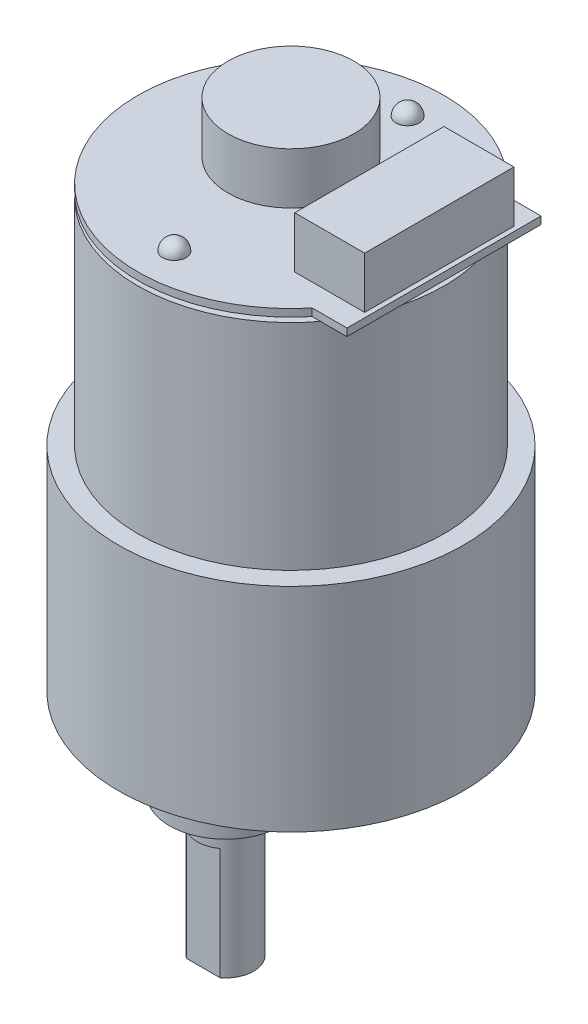
ISO-10303-21;
HEADER;
FILE_DESCRIPTION(('STEP AP214'),'2;1');
FILE_NAME('part.step','',(''),(''),'','','');
FILE_SCHEMA(('AUTOMOTIVE_DESIGN { 1 0 10303 214 1 1 1 1 }'));
ENDSEC;
DATA;
#1=APPLICATION_CONTEXT('core data for automotive mechanical design processes');
#2=APPLICATION_PROTOCOL_DEFINITION('international standard','automotive_design',2000,#1);
#3=PRODUCT_CONTEXT('',#1,'mechanical');
#4=PRODUCT('Part','Part','',(#3));
#5=PRODUCT_RELATED_PRODUCT_CATEGORY('part','',(#4));
#6=PRODUCT_DEFINITION_FORMATION('','',#4);
#7=PRODUCT_DEFINITION_CONTEXT('part definition',#1,'design');
#8=PRODUCT_DEFINITION('design','',#6,#7);
#9=PRODUCT_DEFINITION_SHAPE('','',#8);
#10=(LENGTH_UNIT() NAMED_UNIT(*) SI_UNIT(.MILLI.,.METRE.));
#11=(NAMED_UNIT(*) PLANE_ANGLE_UNIT() SI_UNIT($,.RADIAN.));
#12=(NAMED_UNIT(*) SI_UNIT($,.STERADIAN.) SOLID_ANGLE_UNIT());
#13=UNCERTAINTY_MEASURE_WITH_UNIT(LENGTH_MEASURE(1.E-05),#10,'distance_accuracy_value','');
#14=(GEOMETRIC_REPRESENTATION_CONTEXT(3) GLOBAL_UNCERTAINTY_ASSIGNED_CONTEXT((#13)) GLOBAL_UNIT_ASSIGNED_CONTEXT((#10,
#11,#12)) REPRESENTATION_CONTEXT('',''));
#15=CARTESIAN_POINT('',(0.,0.,0.));
#16=DIRECTION('',(0.,0.,1.));
#17=DIRECTION('',(1.,0.,0.));
#18=AXIS2_PLACEMENT_3D('',#15,#16,#17);
#19=CARTESIAN_POINT('',(0.,24.3,0.));
#20=DIRECTION('',(0.,-1.,0.));
#21=DIRECTION('',(0.,0.,-1.));
#22=AXIS2_PLACEMENT_3D('',#19,#20,#21);
#23=PLANE('',#22);
#24=CARTESIAN_POINT('',(0.,24.3,0.));
#25=DIRECTION('',(0.,1.,0.));
#26=DIRECTION('',(0.,0.,-1.));
#27=AXIS2_PLACEMENT_3D('',#24,#25,#26);
#28=CIRCLE('',#27,16.4);
#29=CARTESIAN_POINT('',(12.6806939873179,24.3,-10.4));
#30=VERTEX_POINT('',#29);
#31=CARTESIAN_POINT('',(12.6806939873179,24.3,10.4));
#32=VERTEX_POINT('',#31);
#33=EDGE_CURVE('E178',#30,#32,#28,.T.);
#34=ORIENTED_EDGE('',*,*,#33,.T.);
#35=DIRECTION('',(1.,0.,0.));
#36=VECTOR('',#35,1.);
#37=CARTESIAN_POINT('',(12.6806939873179,24.3,10.4));
#38=LINE('',#37,#36);
#39=CARTESIAN_POINT('',(16.4,24.3,10.4));
#40=VERTEX_POINT('',#39);
#41=EDGE_CURVE('E185',#32,#40,#38,.T.);
#42=ORIENTED_EDGE('',*,*,#41,.T.);
#43=DIRECTION('',(0.,0.,-1.));
#44=VECTOR('',#43,1.);
#45=CARTESIAN_POINT('',(16.4,24.3,10.4));
#46=LINE('',#45,#44);
#47=CARTESIAN_POINT('',(16.4,24.3,-10.4));
#48=VERTEX_POINT('',#47);
#49=EDGE_CURVE('E187',#40,#48,#46,.T.);
#50=ORIENTED_EDGE('',*,*,#49,.T.);
#51=DIRECTION('',(-1.,0.,0.));
#52=VECTOR('',#51,1.);
#53=CARTESIAN_POINT('',(16.4,24.3,-10.4));
#54=LINE('',#53,#52);
#55=EDGE_CURVE('E186',#48,#30,#54,.T.);
#56=ORIENTED_EDGE('',*,*,#55,.T.);
#57=EDGE_LOOP('',(#34,#42,#50,#56));
#58=FACE_BOUND('',#57,.T.);
#59=CARTESIAN_POINT('',(0.,24.3,-12.5));
#60=DIRECTION('',(0.,-1.,0.));
#61=DIRECTION('',(0.,0.,-1.));
#62=AXIS2_PLACEMENT_3D('',#59,#60,#61);
#63=CIRCLE('',#62,1.25);
#64=CARTESIAN_POINT('',(0.,24.3,-13.75));
#65=VERTEX_POINT('',#64);
#66=EDGE_CURVE('E242',#65,#65,#63,.F.);
#67=ORIENTED_EDGE('',*,*,#66,.F.);
#68=EDGE_LOOP('',(#67));
#69=FACE_BOUND('',#68,.T.);
#70=CARTESIAN_POINT('',(0.,24.3,12.5));
#71=DIRECTION('',(0.,-1.,0.));
#72=DIRECTION('',(0.,0.,-1.));
#73=AXIS2_PLACEMENT_3D('',#70,#71,#72);
#74=CIRCLE('',#73,1.25);
#75=CARTESIAN_POINT('',(0.,24.3,11.25));
#76=VERTEX_POINT('',#75);
#77=EDGE_CURVE('E53',#76,#76,#74,.F.);
#78=ORIENTED_EDGE('',*,*,#77,.F.);
#79=EDGE_LOOP('',(#78));
#80=FACE_BOUND('',#79,.T.);
#81=CARTESIAN_POINT('',(0.,24.3,0.));
#82=DIRECTION('',(0.,-1.,0.));
#83=DIRECTION('',(0.,0.,-1.));
#84=AXIS2_PLACEMENT_3D('',#81,#82,#83);
#85=CIRCLE('',#84,1.);
#86=CARTESIAN_POINT('',(0.,24.3,-1.));
#87=VERTEX_POINT('',#86);
#88=EDGE_CURVE('E11',#87,#87,#85,.F.);
#89=ORIENTED_EDGE('',*,*,#88,.F.);
#90=EDGE_LOOP('',(#89));
#91=FACE_BOUND('',#90,.T.);
#92=DIRECTION('',(-1.,0.,0.));
#93=VECTOR('',#92,1.);
#94=CARTESIAN_POINT('',(8.4,24.3,-8.));
#95=LINE('',#94,#93);
#96=CARTESIAN_POINT('',(15.9,24.3,-8.));
#97=VERTEX_POINT('',#96);
#98=CARTESIAN_POINT('',(8.4,24.3,-8.));
#99=VERTEX_POINT('',#98);
#100=EDGE_CURVE('E157',#97,#99,#95,.T.);
#101=ORIENTED_EDGE('',*,*,#100,.F.);
#102=DIRECTION('',(0.,0.,-1.));
#103=VECTOR('',#102,1.);
#104=CARTESIAN_POINT('',(15.9,24.3,-8.));
#105=LINE('',#104,#103);
#106=CARTESIAN_POINT('',(15.9,24.3,8.));
#107=VERTEX_POINT('',#106);
#108=EDGE_CURVE('E152',#107,#97,#105,.T.);
#109=ORIENTED_EDGE('',*,*,#108,.F.);
#110=DIRECTION('',(1.,0.,0.));
#111=VECTOR('',#110,1.);
#112=CARTESIAN_POINT('',(8.4,24.3,8.));
#113=LINE('',#112,#111);
#114=CARTESIAN_POINT('',(8.4,24.3,8.));
#115=VERTEX_POINT('',#114);
#116=EDGE_CURVE('E66',#115,#107,#113,.T.);
#117=ORIENTED_EDGE('',*,*,#116,.F.);
#118=DIRECTION('',(0.,0.,1.));
#119=VECTOR('',#118,1.);
#120=CARTESIAN_POINT('',(8.4,24.3,-8.));
#121=LINE('',#120,#119);
#122=EDGE_CURVE('E62',#99,#115,#121,.T.);
#123=ORIENTED_EDGE('',*,*,#122,.F.);
#124=EDGE_LOOP('',(#101,#109,#117,#123));
#125=FACE_BOUND('',#124,.T.);
#126=ADVANCED_FACE('F44',(#58,#69,#80,#91,#125),#23,.F.);
#127=CARTESIAN_POINT('',(0.,23.,0.));
#128=DIRECTION('',(0.,-1.,0.));
#129=DIRECTION('',(0.,0.,-1.));
#130=AXIS2_PLACEMENT_3D('',#127,#128,#129);
#131=CYLINDRICAL_SURFACE('',#130,16.4);
#132=CARTESIAN_POINT('',(0.,23.,0.));
#133=DIRECTION('',(0.,1.,0.));
#134=DIRECTION('',(0.,0.,1.));
#135=AXIS2_PLACEMENT_3D('',#132,#133,#134);
#136=CIRCLE('',#135,16.4);
#137=CARTESIAN_POINT('',(0.,23.,16.4));
#138=VERTEX_POINT('',#137);
#139=EDGE_CURVE('E289',#138,#138,#136,.T.);
#140=ORIENTED_EDGE('',*,*,#139,.F.);
#141=EDGE_LOOP('',(#140));
#142=FACE_BOUND('',#141,.T.);
#143=CARTESIAN_POINT('',(0.,0.,0.));
#144=DIRECTION('',(0.,1.,0.));
#145=DIRECTION('',(0.,0.,1.));
#146=AXIS2_PLACEMENT_3D('',#143,#144,#145);
#147=CIRCLE('',#146,16.4);
#148=CARTESIAN_POINT('',(0.,0.,16.4));
#149=VERTEX_POINT('',#148);
#150=EDGE_CURVE('E278',#149,#149,#147,.T.);
#151=ORIENTED_EDGE('',*,*,#150,.T.);
#152=EDGE_LOOP('',(#151));
#153=FACE_BOUND('',#152,.T.);
#154=ADVANCED_FACE('F50',(#142,#153),#131,.T.);
#155=CARTESIAN_POINT('',(0.,23.,0.));
#156=DIRECTION('',(0.,1.,0.));
#157=DIRECTION('',(0.,0.,1.));
#158=AXIS2_PLACEMENT_3D('',#155,#156,#157);
#159=PLANE('',#158);
#160=CARTESIAN_POINT('',(0.,23.,12.5));
#161=DIRECTION('',(0.,1.,0.));
#162=DIRECTION('',(0.,0.,1.));
#163=AXIS2_PLACEMENT_3D('',#160,#161,#162);
#164=CIRCLE('',#163,1.25);
#165=CARTESIAN_POINT('',(0.,23.,13.75));
#166=VERTEX_POINT('',#165);
#167=EDGE_CURVE('E254',#166,#166,#164,.T.);
#168=ORIENTED_EDGE('',*,*,#167,.F.);
#169=EDGE_LOOP('',(#168));
#170=FACE_BOUND('',#169,.T.);
#171=CARTESIAN_POINT('',(0.,23.,-12.5));
#172=DIRECTION('',(0.,1.,0.));
#173=DIRECTION('',(0.,0.,1.));
#174=AXIS2_PLACEMENT_3D('',#171,#172,#173);
#175=CIRCLE('',#174,1.25);
#176=CARTESIAN_POINT('',(0.,23.,-11.25));
#177=VERTEX_POINT('',#176);
#178=EDGE_CURVE('E291',#177,#177,#175,.T.);
#179=ORIENTED_EDGE('',*,*,#178,.F.);
#180=EDGE_LOOP('',(#179));
#181=FACE_BOUND('',#180,.T.);
#182=ORIENTED_EDGE('',*,*,#139,.T.);
#183=EDGE_LOOP('',(#182));
#184=FACE_BOUND('',#183,.T.);
#185=ADVANCED_FACE('F448',(#170,#181,#184),#159,.T.);
#186=CARTESIAN_POINT('',(0.,23.5,-12.5));
#187=DIRECTION('',(0.,-1.,0.));
#188=DIRECTION('',(0.,0.,-1.));
#189=AXIS2_PLACEMENT_3D('',#186,#187,#188);
#190=CYLINDRICAL_SURFACE('',#189,1.25);
#191=CARTESIAN_POINT('',(0.,23.5,-12.5));
#192=DIRECTION('',(0.,1.,0.));
#193=DIRECTION('',(0.,0.,1.));
#194=AXIS2_PLACEMENT_3D('',#191,#192,#193);
#195=CIRCLE('',#194,1.25);
#196=CARTESIAN_POINT('',(0.,23.5,-11.25));
#197=VERTEX_POINT('',#196);
#198=EDGE_CURVE('E288',#197,#197,#195,.T.);
#199=ORIENTED_EDGE('',*,*,#198,.F.);
#200=EDGE_LOOP('',(#199));
#201=FACE_BOUND('',#200,.T.);
#202=ORIENTED_EDGE('',*,*,#178,.T.);
#203=EDGE_LOOP('',(#202));
#204=FACE_BOUND('',#203,.T.);
#205=ADVANCED_FACE('F450',(#201,#204),#190,.T.);
#206=CARTESIAN_POINT('',(0.,23.5,12.5));
#207=DIRECTION('',(0.,-1.,0.));
#208=DIRECTION('',(0.,0.,-1.));
#209=AXIS2_PLACEMENT_3D('',#206,#207,#208);
#210=CYLINDRICAL_SURFACE('',#209,1.25);
#211=CARTESIAN_POINT('',(0.,23.5,12.5));
#212=DIRECTION('',(0.,1.,0.));
#213=DIRECTION('',(0.,0.,1.));
#214=AXIS2_PLACEMENT_3D('',#211,#212,#213);
#215=CIRCLE('',#214,1.25);
#216=CARTESIAN_POINT('',(0.,23.5,13.75));
#217=VERTEX_POINT('',#216);
#218=EDGE_CURVE('E282',#217,#217,#215,.T.);
#219=ORIENTED_EDGE('',*,*,#218,.F.);
#220=EDGE_LOOP('',(#219));
#221=FACE_BOUND('',#220,.T.);
#222=ORIENTED_EDGE('',*,*,#167,.T.);
#223=EDGE_LOOP('',(#222));
#224=FACE_BOUND('',#223,.T.);
#225=ADVANCED_FACE('F442',(#221,#224),#210,.T.);
#226=CARTESIAN_POINT('',(0.,-22.8,0.));
#227=DIRECTION('',(0.,1.,0.));
#228=DIRECTION('',(0.,0.,1.));
#229=AXIS2_PLACEMENT_3D('',#226,#227,#228);
#230=CYLINDRICAL_SURFACE('',#229,18.5);
#231=CARTESIAN_POINT('',(0.,-22.8,0.));
#232=DIRECTION('',(0.,-1.,0.));
#233=DIRECTION('',(0.,0.,-1.));
#234=AXIS2_PLACEMENT_3D('',#231,#232,#233);
#235=CIRCLE('',#234,18.5);
#236=CARTESIAN_POINT('',(0.,-22.8,-18.5));
#237=VERTEX_POINT('',#236);
#238=EDGE_CURVE('E277',#237,#237,#235,.T.);
#239=ORIENTED_EDGE('',*,*,#238,.F.);
#240=EDGE_LOOP('',(#239));
#241=FACE_BOUND('',#240,.T.);
#242=CARTESIAN_POINT('',(0.,0.,0.));
#243=DIRECTION('',(0.,-1.,0.));
#244=DIRECTION('',(0.,0.,-1.));
#245=AXIS2_PLACEMENT_3D('',#242,#243,#244);
#246=CIRCLE('',#245,18.5);
#247=CARTESIAN_POINT('',(0.,0.,-18.5));
#248=VERTEX_POINT('',#247);
#249=EDGE_CURVE('E275',#248,#248,#246,.T.);
#250=ORIENTED_EDGE('',*,*,#249,.T.);
#251=EDGE_LOOP('',(#250));
#252=FACE_BOUND('',#251,.T.);
#253=ADVANCED_FACE('F436',(#241,#252),#230,.T.);
#254=CARTESIAN_POINT('',(0.,-22.8,0.));
#255=DIRECTION('',(0.,-1.,0.));
#256=DIRECTION('',(0.,0.,-1.));
#257=AXIS2_PLACEMENT_3D('',#254,#255,#256);
#258=PLANE('',#257);
#259=CARTESIAN_POINT('',(0.,-22.8,7.));
#260=DIRECTION('',(0.,-1.,0.));
#261=DIRECTION('',(0.,0.,-1.));
#262=AXIS2_PLACEMENT_3D('',#259,#260,#261);
#263=CIRCLE('',#262,6.00670666066777);
#264=CARTESIAN_POINT('',(0.,-22.8,0.993293339332227));
#265=VERTEX_POINT('',#264);
#266=EDGE_CURVE('E244',#265,#265,#263,.T.);
#267=ORIENTED_EDGE('',*,*,#266,.F.);
#268=EDGE_LOOP('',(#267));
#269=FACE_BOUND('',#268,.T.);
#270=CARTESIAN_POINT('',(0.,-22.8,7.));
#271=DIRECTION('',(0.,1.,0.));
#272=DIRECTION('',(0.,0.,-1.));
#273=AXIS2_PLACEMENT_3D('',#270,#271,#272);
#274=CIRCLE('',#273,9.00670666066778);
#275=CARTESIAN_POINT('',(8.81120951945623,-22.8,8.86637393776306));
#276=VERTEX_POINT('',#275);
#277=CARTESIAN_POINT('',(-8.81120951945623,-22.8,8.86637393776305));
#278=VERTEX_POINT('',#277);
#279=EDGE_CURVE('E248',#276,#278,#274,.T.);
#280=ORIENTED_EDGE('',*,*,#279,.F.);
#281=CARTESIAN_POINT('',(0.,-22.8,0.));
#282=DIRECTION('',(0.,-1.,0.));
#283=DIRECTION('',(0.,0.,-1.));
#284=AXIS2_PLACEMENT_3D('',#281,#282,#283);
#285=CIRCLE('',#284,12.5);
#286=EDGE_CURVE('E256',#278,#276,#285,.T.);
#287=ORIENTED_EDGE('',*,*,#286,.F.);
#288=EDGE_LOOP('',(#280,#287));
#289=FACE_BOUND('',#288,.T.);
#290=ORIENTED_EDGE('',*,*,#238,.T.);
#291=EDGE_LOOP('',(#290));
#292=FACE_BOUND('',#291,.T.);
#293=ADVANCED_FACE('F433',(#269,#289,#292),#258,.T.);
#294=CARTESIAN_POINT('',(0.,0.,0.));
#295=DIRECTION('',(0.,-1.,0.));
#296=DIRECTION('',(0.,0.,-1.));
#297=AXIS2_PLACEMENT_3D('',#294,#295,#296);
#298=PLANE('',#297);
#299=ORIENTED_EDGE('',*,*,#150,.F.);
#300=EDGE_LOOP('',(#299));
#301=FACE_BOUND('',#300,.T.);
#302=ORIENTED_EDGE('',*,*,#249,.F.);
#303=EDGE_LOOP('',(#302));
#304=FACE_BOUND('',#303,.T.);
#305=ADVANCED_FACE('F431',(#301,#304),#298,.F.);
#306=CARTESIAN_POINT('',(0.,-21.8,7.));
#307=DIRECTION('',(0.,-1.,0.));
#308=DIRECTION('',(0.,0.,-1.));
#309=AXIS2_PLACEMENT_3D('',#306,#307,#308);
#310=CYLINDRICAL_SURFACE('',#309,9.00670666066778);
#311=ORIENTED_EDGE('',*,*,#279,.T.);
#312=DIRECTION('',(0.,-1.,0.));
#313=VECTOR('',#312,1.);
#314=CARTESIAN_POINT('',(-8.81120951945623,-21.8,8.86637393776305));
#315=LINE('',#314,#313);
#316=CARTESIAN_POINT('',(-8.81120951945623,-21.8,8.86637393776305));
#317=VERTEX_POINT('',#316);
#318=EDGE_CURVE('E263',#317,#278,#315,.T.);
#319=ORIENTED_EDGE('',*,*,#318,.F.);
#320=CARTESIAN_POINT('',(0.,-21.8,7.));
#321=DIRECTION('',(0.,1.,0.));
#322=DIRECTION('',(0.,0.,-1.));
#323=AXIS2_PLACEMENT_3D('',#320,#321,#322);
#324=CIRCLE('',#323,9.00670666066778);
#325=CARTESIAN_POINT('',(8.81120951945623,-21.8,8.86637393776306));
#326=VERTEX_POINT('',#325);
#327=EDGE_CURVE('E251',#326,#317,#324,.T.);
#328=ORIENTED_EDGE('',*,*,#327,.F.);
#329=DIRECTION('',(0.,-1.,0.));
#330=VECTOR('',#329,1.);
#331=CARTESIAN_POINT('',(8.81120951945623,-21.8,8.86637393776306));
#332=LINE('',#331,#330);
#333=EDGE_CURVE('E268',#326,#276,#332,.T.);
#334=ORIENTED_EDGE('',*,*,#333,.T.);
#335=EDGE_LOOP('',(#311,#319,#328,#334));
#336=FACE_BOUND('',#335,.T.);
#337=ADVANCED_FACE('F430',(#336),#310,.T.);
#338=CARTESIAN_POINT('',(0.,-21.8,0.));
#339=DIRECTION('',(0.,-1.,0.));
#340=DIRECTION('',(0.,0.,-1.));
#341=AXIS2_PLACEMENT_3D('',#338,#339,#340);
#342=CYLINDRICAL_SURFACE('',#341,12.5);
#343=ORIENTED_EDGE('',*,*,#286,.T.);
#344=ORIENTED_EDGE('',*,*,#333,.F.);
#345=CARTESIAN_POINT('',(0.,-21.8,0.));
#346=DIRECTION('',(0.,-1.,0.));
#347=DIRECTION('',(0.,0.,-1.));
#348=AXIS2_PLACEMENT_3D('',#345,#346,#347);
#349=CIRCLE('',#348,12.5);
#350=EDGE_CURVE('E259',#317,#326,#349,.T.);
#351=ORIENTED_EDGE('',*,*,#350,.F.);
#352=ORIENTED_EDGE('',*,*,#318,.T.);
#353=EDGE_LOOP('',(#343,#344,#351,#352));
#354=FACE_BOUND('',#353,.T.);
#355=ADVANCED_FACE('F421',(#354),#342,.F.);
#356=CARTESIAN_POINT('',(0.,-21.8,3.5));
#357=DIRECTION('',(0.,-1.,0.));
#358=DIRECTION('',(0.,0.,-1.));
#359=AXIS2_PLACEMENT_3D('',#356,#357,#358);
#360=PLANE('',#359);
#361=ORIENTED_EDGE('',*,*,#327,.T.);
#362=ORIENTED_EDGE('',*,*,#350,.T.);
#363=EDGE_LOOP('',(#361,#362));
#364=FACE_BOUND('',#363,.T.);
#365=ADVANCED_FACE('F418',(#364),#360,.T.);
#366=CARTESIAN_POINT('',(0.,-28.8,7.));
#367=DIRECTION('',(0.,1.,0.));
#368=DIRECTION('',(0.,0.,1.));
#369=AXIS2_PLACEMENT_3D('',#366,#367,#368);
#370=CYLINDRICAL_SURFACE('',#369,6.00670666066777);
#371=CARTESIAN_POINT('',(0.,-28.8,7.));
#372=DIRECTION('',(0.,-1.,0.));
#373=DIRECTION('',(0.,0.,-1.));
#374=AXIS2_PLACEMENT_3D('',#371,#372,#373);
#375=CIRCLE('',#374,6.00670666066777);
#376=CARTESIAN_POINT('',(0.,-28.8,0.993293339332227));
#377=VERTEX_POINT('',#376);
#378=EDGE_CURVE('E237',#377,#377,#375,.T.);
#379=ORIENTED_EDGE('',*,*,#378,.F.);
#380=EDGE_LOOP('',(#379));
#381=FACE_BOUND('',#380,.T.);
#382=ORIENTED_EDGE('',*,*,#266,.T.);
#383=EDGE_LOOP('',(#382));
#384=FACE_BOUND('',#383,.T.);
#385=ADVANCED_FACE('F414',(#381,#384),#370,.T.);
#386=CARTESIAN_POINT('',(0.,-28.8,7.));
#387=DIRECTION('',(0.,-1.,0.));
#388=DIRECTION('',(0.,0.,-1.));
#389=AXIS2_PLACEMENT_3D('',#386,#387,#388);
#390=PLANE('',#389);
#391=CARTESIAN_POINT('',(0.,-28.8,7.));
#392=DIRECTION('',(0.,-1.,0.));
#393=DIRECTION('',(0.,0.,-1.));
#394=AXIS2_PLACEMENT_3D('',#391,#392,#393);
#395=CIRCLE('',#394,3.);
#396=CARTESIAN_POINT('',(0.,-28.8,4.));
#397=VERTEX_POINT('',#396);
#398=EDGE_CURVE('E239',#397,#397,#395,.T.);
#399=ORIENTED_EDGE('',*,*,#398,.F.);
#400=EDGE_LOOP('',(#399));
#401=FACE_BOUND('',#400,.T.);
#402=ORIENTED_EDGE('',*,*,#378,.T.);
#403=EDGE_LOOP('',(#402));
#404=FACE_BOUND('',#403,.T.);
#405=ADVANCED_FACE('F411',(#401,#404),#390,.T.);
#406=CARTESIAN_POINT('',(0.,-43.8,7.));
#407=DIRECTION('',(0.,1.,0.));
#408=DIRECTION('',(0.,0.,1.));
#409=AXIS2_PLACEMENT_3D('',#406,#407,#408);
#410=CYLINDRICAL_SURFACE('',#409,3.);
#411=CARTESIAN_POINT('',(0.,-31.8,7.));
#412=DIRECTION('',(0.,-1.,0.));
#413=DIRECTION('',(0.,0.,-1.));
#414=AXIS2_PLACEMENT_3D('',#411,#412,#413);
#415=CIRCLE('',#414,3.);
#416=CARTESIAN_POINT('',(1.8,-31.8,9.4));
#417=VERTEX_POINT('',#416);
#418=CARTESIAN_POINT('',(-1.8,-31.8,9.4));
#419=VERTEX_POINT('',#418);
#420=EDGE_CURVE('E219',#417,#419,#415,.T.);
#421=ORIENTED_EDGE('',*,*,#420,.F.);
#422=DIRECTION('',(0.,-1.,0.));
#423=VECTOR('',#422,1.);
#424=CARTESIAN_POINT('',(1.8,-31.8,9.4));
#425=LINE('',#424,#423);
#426=CARTESIAN_POINT('',(1.8,-43.8,9.4));
#427=VERTEX_POINT('',#426);
#428=EDGE_CURVE('E230',#417,#427,#425,.T.);
#429=ORIENTED_EDGE('',*,*,#428,.T.);
#430=CARTESIAN_POINT('',(0.,-43.8,7.));
#431=DIRECTION('',(0.,-1.,0.));
#432=DIRECTION('',(0.,0.,-1.));
#433=AXIS2_PLACEMENT_3D('',#430,#431,#432);
#434=CIRCLE('',#433,3.);
#435=CARTESIAN_POINT('',(-1.8,-43.8,9.4));
#436=VERTEX_POINT('',#435);
#437=EDGE_CURVE('E231',#436,#427,#434,.T.);
#438=ORIENTED_EDGE('',*,*,#437,.F.);
#439=DIRECTION('',(0.,-1.,0.));
#440=VECTOR('',#439,1.);
#441=CARTESIAN_POINT('',(-1.8,-31.8,9.4));
#442=LINE('',#441,#440);
#443=EDGE_CURVE('E228',#419,#436,#442,.T.);
#444=ORIENTED_EDGE('',*,*,#443,.F.);
#445=EDGE_LOOP('',(#421,#429,#438,#444));
#446=FACE_BOUND('',#445,.T.);
#447=ORIENTED_EDGE('',*,*,#398,.T.);
#448=EDGE_LOOP('',(#447));
#449=FACE_BOUND('',#448,.T.);
#450=ADVANCED_FACE('F410',(#446,#449),#410,.T.);
#451=CARTESIAN_POINT('',(0.,-43.8,7.));
#452=DIRECTION('',(0.,-1.,0.));
#453=DIRECTION('',(0.,0.,-1.));
#454=AXIS2_PLACEMENT_3D('',#451,#452,#453);
#455=PLANE('',#454);
#456=DIRECTION('',(1.,0.,0.));
#457=VECTOR('',#456,1.);
#458=CARTESIAN_POINT('',(-1.8,-43.8,9.4));
#459=LINE('',#458,#457);
#460=EDGE_CURVE('E217',#436,#427,#459,.T.);
#461=ORIENTED_EDGE('',*,*,#460,.F.);
#462=ORIENTED_EDGE('',*,*,#437,.T.);
#463=EDGE_LOOP('',(#461,#462));
#464=FACE_BOUND('',#463,.T.);
#465=ADVANCED_FACE('F401',(#464),#455,.T.);
#466=CARTESIAN_POINT('',(-1.8,-31.8,9.4));
#467=DIRECTION('',(0.,0.,-1.));
#468=DIRECTION('',(-1.,0.,0.));
#469=AXIS2_PLACEMENT_3D('',#466,#467,#468);
#470=PLANE('',#469);
#471=ORIENTED_EDGE('',*,*,#460,.T.);
#472=ORIENTED_EDGE('',*,*,#428,.F.);
#473=DIRECTION('',(1.,0.,0.));
#474=VECTOR('',#473,1.);
#475=CARTESIAN_POINT('',(-1.8,-31.8,9.4));
#476=LINE('',#475,#474);
#477=EDGE_CURVE('E224',#419,#417,#476,.T.);
#478=ORIENTED_EDGE('',*,*,#477,.F.);
#479=ORIENTED_EDGE('',*,*,#443,.T.);
#480=EDGE_LOOP('',(#471,#472,#478,#479));
#481=FACE_BOUND('',#480,.T.);
#482=ADVANCED_FACE('F398',(#481),#470,.F.);
#483=CARTESIAN_POINT('',(0.,-31.8,7.));
#484=DIRECTION('',(0.,-1.,0.));
#485=DIRECTION('',(0.,0.,-1.));
#486=AXIS2_PLACEMENT_3D('',#483,#484,#485);
#487=PLANE('',#486);
#488=ORIENTED_EDGE('',*,*,#420,.T.);
#489=ORIENTED_EDGE('',*,*,#477,.T.);
#490=EDGE_LOOP('',(#488,#489));
#491=FACE_BOUND('',#490,.T.);
#492=ADVANCED_FACE('F394',(#491),#487,.T.);
#493=CARTESIAN_POINT('',(0.,24.3,0.));
#494=DIRECTION('',(0.,-1.,0.));
#495=DIRECTION('',(0.,0.,-1.));
#496=AXIS2_PLACEMENT_3D('',#493,#494,#495);
#497=CYLINDRICAL_SURFACE('',#496,16.4);
#498=CARTESIAN_POINT('',(0.,23.5,0.));
#499=DIRECTION('',(0.,1.,0.));
#500=DIRECTION('',(0.,0.,-1.));
#501=AXIS2_PLACEMENT_3D('',#498,#499,#500);
#502=CIRCLE('',#501,16.4);
#503=CARTESIAN_POINT('',(12.6806939873179,23.5,-10.4));
#504=VERTEX_POINT('',#503);
#505=CARTESIAN_POINT('',(12.6806939873179,23.5,10.4));
#506=VERTEX_POINT('',#505);
#507=EDGE_CURVE('E180',#504,#506,#502,.T.);
#508=ORIENTED_EDGE('',*,*,#507,.T.);
#509=DIRECTION('',(0.,-1.,0.));
#510=VECTOR('',#509,1.);
#511=CARTESIAN_POINT('',(12.6806939873179,24.3,10.4));
#512=LINE('',#511,#510);
#513=EDGE_CURVE('E213',#32,#506,#512,.T.);
#514=ORIENTED_EDGE('',*,*,#513,.F.);
#515=ORIENTED_EDGE('',*,*,#33,.F.);
#516=DIRECTION('',(0.,-1.,0.));
#517=VECTOR('',#516,1.);
#518=CARTESIAN_POINT('',(12.6806939873179,24.3,-10.4));
#519=LINE('',#518,#517);
#520=EDGE_CURVE('E195',#30,#504,#519,.T.);
#521=ORIENTED_EDGE('',*,*,#520,.T.);
#522=EDGE_LOOP('',(#508,#514,#515,#521));
#523=FACE_BOUND('',#522,.T.);
#524=ADVANCED_FACE('F391',(#523),#497,.T.);
#525=CARTESIAN_POINT('',(12.6806939873179,24.3,10.4));
#526=DIRECTION('',(0.,0.,-1.));
#527=DIRECTION('',(-1.,0.,0.));
#528=AXIS2_PLACEMENT_3D('',#525,#526,#527);
#529=PLANE('',#528);
#530=DIRECTION('',(1.,0.,0.));
#531=VECTOR('',#530,1.);
#532=CARTESIAN_POINT('',(12.6806939873179,23.5,10.4));
#533=LINE('',#532,#531);
#534=CARTESIAN_POINT('',(16.4,23.5,10.4));
#535=VERTEX_POINT('',#534);
#536=EDGE_CURVE('E196',#506,#535,#533,.T.);
#537=ORIENTED_EDGE('',*,*,#536,.T.);
#538=DIRECTION('',(0.,-1.,0.));
#539=VECTOR('',#538,1.);
#540=CARTESIAN_POINT('',(16.4,24.3,10.4));
#541=LINE('',#540,#539);
#542=EDGE_CURVE('E212',#40,#535,#541,.T.);
#543=ORIENTED_EDGE('',*,*,#542,.F.);
#544=ORIENTED_EDGE('',*,*,#41,.F.);
#545=ORIENTED_EDGE('',*,*,#513,.T.);
#546=EDGE_LOOP('',(#537,#543,#544,#545));
#547=FACE_BOUND('',#546,.T.);
#548=ADVANCED_FACE('F390',(#547),#529,.F.);
#549=CARTESIAN_POINT('',(16.4,24.3,10.4));
#550=DIRECTION('',(-1.,0.,0.));
#551=DIRECTION('',(0.,0.,1.));
#552=AXIS2_PLACEMENT_3D('',#549,#550,#551);
#553=PLANE('',#552);
#554=DIRECTION('',(0.,0.,-1.));
#555=VECTOR('',#554,1.);
#556=CARTESIAN_POINT('',(16.4,23.5,10.4));
#557=LINE('',#556,#555);
#558=CARTESIAN_POINT('',(16.4,23.5,-10.4));
#559=VERTEX_POINT('',#558);
#560=EDGE_CURVE('E197',#535,#559,#557,.T.);
#561=ORIENTED_EDGE('',*,*,#560,.T.);
#562=DIRECTION('',(0.,-1.,0.));
#563=VECTOR('',#562,1.);
#564=CARTESIAN_POINT('',(16.4,24.3,-10.4));
#565=LINE('',#564,#563);
#566=EDGE_CURVE('E210',#48,#559,#565,.T.);
#567=ORIENTED_EDGE('',*,*,#566,.F.);
#568=ORIENTED_EDGE('',*,*,#49,.F.);
#569=ORIENTED_EDGE('',*,*,#542,.T.);
#570=EDGE_LOOP('',(#561,#567,#568,#569));
#571=FACE_BOUND('',#570,.T.);
#572=ADVANCED_FACE('F384',(#571),#553,.F.);
#573=CARTESIAN_POINT('',(16.4,24.3,-10.4));
#574=DIRECTION('',(0.,0.,1.));
#575=DIRECTION('',(1.,0.,0.));
#576=AXIS2_PLACEMENT_3D('',#573,#574,#575);
#577=PLANE('',#576);
#578=DIRECTION('',(-1.,0.,0.));
#579=VECTOR('',#578,1.);
#580=CARTESIAN_POINT('',(16.4,23.5,-10.4));
#581=LINE('',#580,#579);
#582=EDGE_CURVE('E182',#559,#504,#581,.T.);
#583=ORIENTED_EDGE('',*,*,#582,.T.);
#584=ORIENTED_EDGE('',*,*,#520,.F.);
#585=ORIENTED_EDGE('',*,*,#55,.F.);
#586=ORIENTED_EDGE('',*,*,#566,.T.);
#587=EDGE_LOOP('',(#583,#584,#585,#586));
#588=FACE_BOUND('',#587,.T.);
#589=ADVANCED_FACE('F378',(#588),#577,.F.);
#590=CARTESIAN_POINT('',(0.,23.5,0.));
#591=DIRECTION('',(0.,-1.,0.));
#592=DIRECTION('',(0.,0.,-1.));
#593=AXIS2_PLACEMENT_3D('',#590,#591,#592);
#594=PLANE('',#593);
#595=ORIENTED_EDGE('',*,*,#198,.T.);
#596=EDGE_LOOP('',(#595));
#597=FACE_BOUND('',#596,.T.);
#598=ORIENTED_EDGE('',*,*,#218,.T.);
#599=EDGE_LOOP('',(#598));
#600=FACE_BOUND('',#599,.T.);
#601=ORIENTED_EDGE('',*,*,#507,.F.);
#602=ORIENTED_EDGE('',*,*,#582,.F.);
#603=ORIENTED_EDGE('',*,*,#560,.F.);
#604=ORIENTED_EDGE('',*,*,#536,.F.);
#605=EDGE_LOOP('',(#601,#602,#603,#604));
#606=FACE_BOUND('',#605,.T.);
#607=ADVANCED_FACE('F372',(#597,#600,#606),#594,.T.);
#608=CARTESIAN_POINT('',(0.,24.3,-12.5));
#609=DIRECTION('',(0.,0.,1.));
#610=DIRECTION('',(-1.,0.,0.));
#611=AXIS2_PLACEMENT_3D('',#608,#609,#610);
#612=SPHERICAL_SURFACE('',#611,1.25);
#613=CARTESIAN_POINT('',(0.,24.3,-12.5));
#614=DIRECTION('',(0.,-1.,0.));
#615=DIRECTION('',(0.,0.,-1.));
#616=AXIS2_PLACEMENT_3D('',#613,#614,#615);
#617=SPHERICAL_SURFACE('',#616,1.25);
#618=ORIENTED_EDGE('',*,*,#66,.T.);
#619=EDGE_LOOP('',(#618));
#620=FACE_BOUND('',#619,.T.);
#621=ADVANCED_FACE('F375',(#620),#617,.T.);
#622=CARTESIAN_POINT('',(0.,24.3,12.5));
#623=DIRECTION('',(0.,0.,1.));
#624=DIRECTION('',(-1.,0.,0.));
#625=AXIS2_PLACEMENT_3D('',#622,#623,#624);
#626=SPHERICAL_SURFACE('',#625,1.25);
#627=CARTESIAN_POINT('',(0.,24.3,12.5));
#628=DIRECTION('',(0.,-1.,0.));
#629=DIRECTION('',(0.,0.,-1.));
#630=AXIS2_PLACEMENT_3D('',#627,#628,#629);
#631=SPHERICAL_SURFACE('',#630,1.25);
#632=ORIENTED_EDGE('',*,*,#77,.T.);
#633=EDGE_LOOP('',(#632));
#634=FACE_BOUND('',#633,.T.);
#635=ADVANCED_FACE('F315',(#634),#631,.T.);
#636=CARTESIAN_POINT('',(0.,26.8,0.));
#637=DIRECTION('',(0.,-1.,0.));
#638=DIRECTION('',(0.,0.,-1.));
#639=AXIS2_PLACEMENT_3D('',#636,#637,#638);
#640=CYLINDRICAL_SURFACE('',#639,1.);
#641=CARTESIAN_POINT('',(0.,26.8,0.));
#642=DIRECTION('',(0.,1.,0.));
#643=DIRECTION('',(0.,0.,1.));
#644=AXIS2_PLACEMENT_3D('',#641,#642,#643);
#645=CIRCLE('',#644,1.);
#646=CARTESIAN_POINT('',(0.,26.8,1.));
#647=VERTEX_POINT('',#646);
#648=EDGE_CURVE('E175',#647,#647,#645,.T.);
#649=ORIENTED_EDGE('',*,*,#648,.F.);
#650=EDGE_LOOP('',(#649));
#651=FACE_BOUND('',#650,.T.);
#652=ORIENTED_EDGE('',*,*,#88,.T.);
#653=EDGE_LOOP('',(#652));
#654=FACE_BOUND('',#653,.T.);
#655=ADVANCED_FACE('F362',(#651,#654),#640,.T.);
#656=CARTESIAN_POINT('',(0.,32.3,0.));
#657=DIRECTION('',(0.,-1.,0.));
#658=DIRECTION('',(0.,0.,-1.));
#659=AXIS2_PLACEMENT_3D('',#656,#657,#658);
#660=CYLINDRICAL_SURFACE('',#659,6.75);
#661=CARTESIAN_POINT('',(0.,32.3,0.));
#662=DIRECTION('',(0.,1.,0.));
#663=DIRECTION('',(0.,0.,1.));
#664=AXIS2_PLACEMENT_3D('',#661,#662,#663);
#665=CIRCLE('',#664,6.75);
#666=CARTESIAN_POINT('',(0.,32.3,6.75));
#667=VERTEX_POINT('',#666);
#668=EDGE_CURVE('E165',#667,#667,#665,.T.);
#669=ORIENTED_EDGE('',*,*,#668,.F.);
#670=EDGE_LOOP('',(#669));
#671=FACE_BOUND('',#670,.T.);
#672=CARTESIAN_POINT('',(0.,26.8,0.));
#673=DIRECTION('',(0.,1.,0.));
#674=DIRECTION('',(0.,0.,1.));
#675=AXIS2_PLACEMENT_3D('',#672,#673,#674);
#676=CIRCLE('',#675,6.75);
#677=CARTESIAN_POINT('',(0.,26.8,6.75));
#678=VERTEX_POINT('',#677);
#679=EDGE_CURVE('E158',#678,#678,#676,.T.);
#680=ORIENTED_EDGE('',*,*,#679,.T.);
#681=EDGE_LOOP('',(#680));
#682=FACE_BOUND('',#681,.T.);
#683=ADVANCED_FACE('F356',(#671,#682),#660,.T.);
#684=CARTESIAN_POINT('',(0.,32.3,0.));
#685=DIRECTION('',(0.,1.,0.));
#686=DIRECTION('',(0.,0.,1.));
#687=AXIS2_PLACEMENT_3D('',#684,#685,#686);
#688=PLANE('',#687);
#689=ORIENTED_EDGE('',*,*,#668,.T.);
#690=EDGE_LOOP('',(#689));
#691=FACE_BOUND('',#690,.T.);
#692=ADVANCED_FACE('F355',(#691),#688,.T.);
#693=CARTESIAN_POINT('',(0.,26.8,0.));
#694=DIRECTION('',(0.,1.,0.));
#695=DIRECTION('',(0.,0.,1.));
#696=AXIS2_PLACEMENT_3D('',#693,#694,#695);
#697=PLANE('',#696);
#698=ORIENTED_EDGE('',*,*,#648,.T.);
#699=EDGE_LOOP('',(#698));
#700=FACE_BOUND('',#699,.T.);
#701=ORIENTED_EDGE('',*,*,#679,.F.);
#702=EDGE_LOOP('',(#701));
#703=FACE_BOUND('',#702,.T.);
#704=ADVANCED_FACE('F353',(#700,#703),#697,.F.);
#705=CARTESIAN_POINT('',(8.4,29.8,-8.));
#706=DIRECTION('',(0.,0.,1.));
#707=DIRECTION('',(1.,0.,0.));
#708=AXIS2_PLACEMENT_3D('',#705,#706,#707);
#709=PLANE('',#708);
#710=ORIENTED_EDGE('',*,*,#100,.T.);
#711=DIRECTION('',(0.,-1.,0.));
#712=VECTOR('',#711,1.);
#713=CARTESIAN_POINT('',(8.4,29.8,-8.));
#714=LINE('',#713,#712);
#715=CARTESIAN_POINT('',(8.4,29.8,-8.));
#716=VERTEX_POINT('',#715);
#717=EDGE_CURVE('E136',#716,#99,#714,.T.);
#718=ORIENTED_EDGE('',*,*,#717,.F.);
#719=DIRECTION('',(-1.,0.,0.));
#720=VECTOR('',#719,1.);
#721=CARTESIAN_POINT('',(8.4,29.8,-8.));
#722=LINE('',#721,#720);
#723=CARTESIAN_POINT('',(15.9,29.8,-8.));
#724=VERTEX_POINT('',#723);
#725=EDGE_CURVE('E144',#724,#716,#722,.T.);
#726=ORIENTED_EDGE('',*,*,#725,.F.);
#727=DIRECTION('',(0.,-1.,0.));
#728=VECTOR('',#727,1.);
#729=CARTESIAN_POINT('',(15.9,29.8,-8.));
#730=LINE('',#729,#728);
#731=EDGE_CURVE('E323',#724,#97,#730,.T.);
#732=ORIENTED_EDGE('',*,*,#731,.T.);
#733=EDGE_LOOP('',(#710,#718,#726,#732));
#734=FACE_BOUND('',#733,.T.);
#735=ADVANCED_FACE('F156',(#734),#709,.F.);
#736=CARTESIAN_POINT('',(8.4,29.8,-8.));
#737=DIRECTION('',(1.,0.,0.));
#738=DIRECTION('',(0.,0.,-1.));
#739=AXIS2_PLACEMENT_3D('',#736,#737,#738);
#740=PLANE('',#739);
#741=ORIENTED_EDGE('',*,*,#122,.T.);
#742=DIRECTION('',(0.,-1.,0.));
#743=VECTOR('',#742,1.);
#744=CARTESIAN_POINT('',(8.4,29.8,8.));
#745=LINE('',#744,#743);
#746=CARTESIAN_POINT('',(8.4,29.8,8.));
#747=VERTEX_POINT('',#746);
#748=EDGE_CURVE('E138',#747,#115,#745,.T.);
#749=ORIENTED_EDGE('',*,*,#748,.F.);
#750=DIRECTION('',(0.,0.,1.));
#751=VECTOR('',#750,1.);
#752=CARTESIAN_POINT('',(8.4,29.8,-8.));
#753=LINE('',#752,#751);
#754=EDGE_CURVE('E135',#716,#747,#753,.T.);
#755=ORIENTED_EDGE('',*,*,#754,.F.);
#756=ORIENTED_EDGE('',*,*,#717,.T.);
#757=EDGE_LOOP('',(#741,#749,#755,#756));
#758=FACE_BOUND('',#757,.T.);
#759=ADVANCED_FACE('F132',(#758),#740,.F.);
#760=CARTESIAN_POINT('',(8.4,29.8,8.));
#761=DIRECTION('',(0.,0.,-1.));
#762=DIRECTION('',(-1.,0.,0.));
#763=AXIS2_PLACEMENT_3D('',#760,#761,#762);
#764=PLANE('',#763);
#765=ORIENTED_EDGE('',*,*,#116,.T.);
#766=DIRECTION('',(0.,-1.,0.));
#767=VECTOR('',#766,1.);
#768=CARTESIAN_POINT('',(15.9,29.8,8.));
#769=LINE('',#768,#767);
#770=CARTESIAN_POINT('',(15.9,29.8,8.));
#771=VERTEX_POINT('',#770);
#772=EDGE_CURVE('E168',#771,#107,#769,.T.);
#773=ORIENTED_EDGE('',*,*,#772,.F.);
#774=DIRECTION('',(1.,0.,0.));
#775=VECTOR('',#774,1.);
#776=CARTESIAN_POINT('',(8.4,29.8,8.));
#777=LINE('',#776,#775);
#778=EDGE_CURVE('E141',#747,#771,#777,.T.);
#779=ORIENTED_EDGE('',*,*,#778,.F.);
#780=ORIENTED_EDGE('',*,*,#748,.T.);
#781=EDGE_LOOP('',(#765,#773,#779,#780));
#782=FACE_BOUND('',#781,.T.);
#783=ADVANCED_FACE('F342',(#782),#764,.F.);
#784=CARTESIAN_POINT('',(15.9,29.8,-8.));
#785=DIRECTION('',(-1.,0.,0.));
#786=DIRECTION('',(0.,0.,1.));
#787=AXIS2_PLACEMENT_3D('',#784,#785,#786);
#788=PLANE('',#787);
#789=ORIENTED_EDGE('',*,*,#108,.T.);
#790=ORIENTED_EDGE('',*,*,#731,.F.);
#791=DIRECTION('',(0.,0.,-1.));
#792=VECTOR('',#791,1.);
#793=CARTESIAN_POINT('',(15.9,29.8,-8.));
#794=LINE('',#793,#792);
#795=EDGE_CURVE('E146',#771,#724,#794,.T.);
#796=ORIENTED_EDGE('',*,*,#795,.F.);
#797=ORIENTED_EDGE('',*,*,#772,.T.);
#798=EDGE_LOOP('',(#789,#790,#796,#797));
#799=FACE_BOUND('',#798,.T.);
#800=ADVANCED_FACE('F321',(#799),#788,.F.);
#801=CARTESIAN_POINT('',(0.,29.8,0.));
#802=DIRECTION('',(0.,-1.,0.));
#803=DIRECTION('',(0.,0.,-1.));
#804=AXIS2_PLACEMENT_3D('',#801,#802,#803);
#805=PLANE('',#804);
#806=ORIENTED_EDGE('',*,*,#725,.T.);
#807=ORIENTED_EDGE('',*,*,#754,.T.);
#808=ORIENTED_EDGE('',*,*,#778,.T.);
#809=ORIENTED_EDGE('',*,*,#795,.T.);
#810=EDGE_LOOP('',(#806,#807,#808,#809));
#811=FACE_BOUND('',#810,.T.);
#812=ADVANCED_FACE('F150',(#811),#805,.F.);
#813=CLOSED_SHELL('',(#126,#154,#185,#205,#225,#253,#293,#305,#337,#355,#365,#385,#405,#450,
#465,#482,#492,#524,#548,#572,#589,#607,#621,#635,#655,#683,#692,#704,#735,#759,#783,#800,#812));
#814=MANIFOLD_SOLID_BREP('B2',#813);
#815=ADVANCED_BREP_SHAPE_REPRESENTATION('',(#18,#814),#14);
#816=SHAPE_DEFINITION_REPRESENTATION(#9,#815);
ENDSEC;
END-ISO-10303-21;
